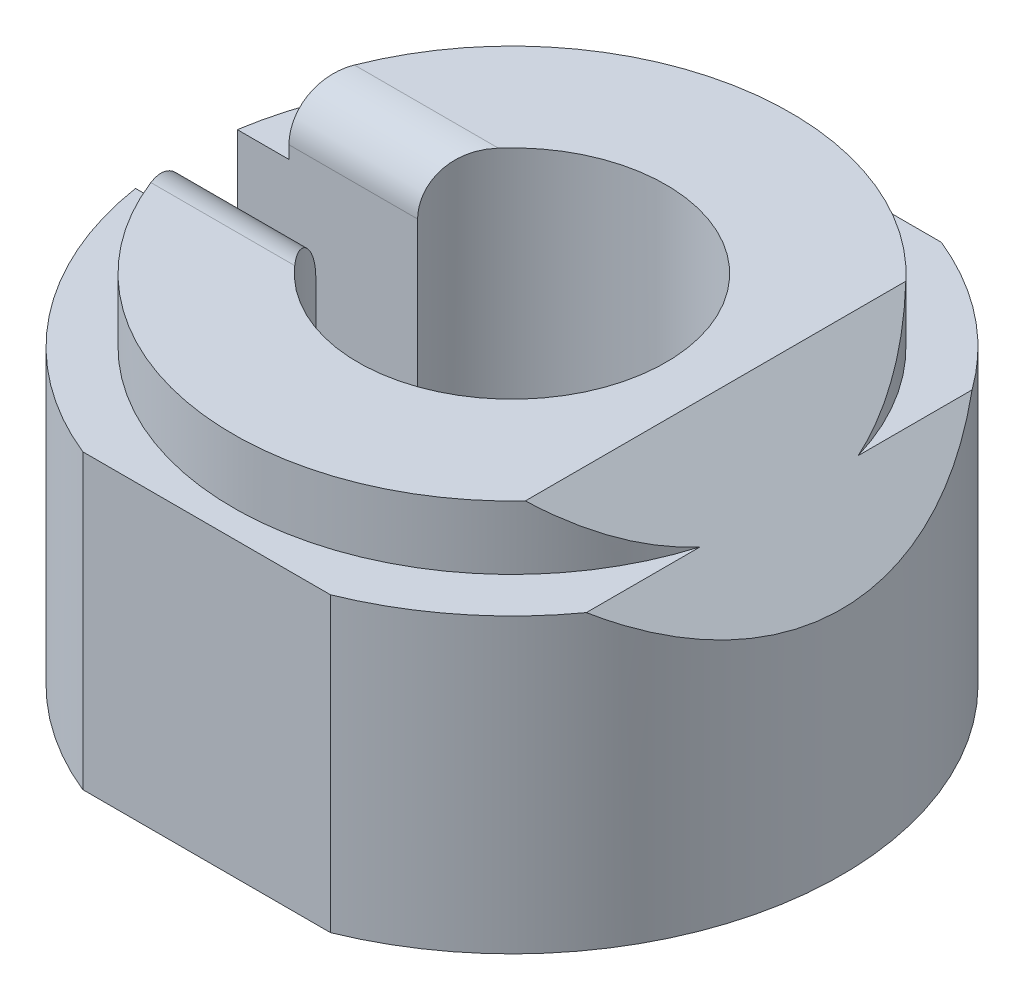
ISO-10303-21;
HEADER;
FILE_DESCRIPTION(('STEP AP214'),'2;1');
FILE_NAME('part.step','',(''),(''),'','','');
FILE_SCHEMA(('AUTOMOTIVE_DESIGN { 1 0 10303 214 1 1 1 1 }'));
ENDSEC;
DATA;
#1=APPLICATION_CONTEXT('core data for automotive mechanical design processes');
#2=APPLICATION_PROTOCOL_DEFINITION('international standard','automotive_design',2000,#1);
#3=PRODUCT_CONTEXT('',#1,'mechanical');
#4=PRODUCT('Part','Part','',(#3));
#5=PRODUCT_RELATED_PRODUCT_CATEGORY('part','',(#4));
#6=PRODUCT_DEFINITION_FORMATION('','',#4);
#7=PRODUCT_DEFINITION_CONTEXT('part definition',#1,'design');
#8=PRODUCT_DEFINITION('design','',#6,#7);
#9=PRODUCT_DEFINITION_SHAPE('','',#8);
#10=(LENGTH_UNIT() NAMED_UNIT(*) SI_UNIT(.MILLI.,.METRE.));
#11=(NAMED_UNIT(*) PLANE_ANGLE_UNIT() SI_UNIT($,.RADIAN.));
#12=(NAMED_UNIT(*) SI_UNIT($,.STERADIAN.) SOLID_ANGLE_UNIT());
#13=UNCERTAINTY_MEASURE_WITH_UNIT(LENGTH_MEASURE(1.E-05),#10,'distance_accuracy_value','');
#14=(GEOMETRIC_REPRESENTATION_CONTEXT(3) GLOBAL_UNCERTAINTY_ASSIGNED_CONTEXT((#13)) GLOBAL_UNIT_ASSIGNED_CONTEXT((#10,
#11,#12)) REPRESENTATION_CONTEXT('',''));
#15=CARTESIAN_POINT('',(0.,0.,0.));
#16=DIRECTION('',(0.,0.,1.));
#17=DIRECTION('',(1.,0.,0.));
#18=AXIS2_PLACEMENT_3D('',#15,#16,#17);
#19=CARTESIAN_POINT('',(0.,9.5,0.));
#20=DIRECTION('',(0.,1.,0.));
#21=DIRECTION('',(0.,0.,1.));
#22=AXIS2_PLACEMENT_3D('',#19,#20,#21);
#23=PLANE('',#22);
#24=CARTESIAN_POINT('',(0.,9.5,0.));
#25=DIRECTION('',(0.,1.,0.));
#26=DIRECTION('',(0.,0.,1.));
#27=AXIS2_PLACEMENT_3D('',#24,#25,#26);
#28=CIRCLE('',#27,12.95);
#29=CARTESIAN_POINT('',(-4.86852133609374,9.5,-12.));
#30=VERTEX_POINT('',#29);
#31=CARTESIAN_POINT('',(-12.7946277788766,9.5,-2.));
#32=VERTEX_POINT('',#31);
#33=EDGE_CURVE('E240',#30,#32,#28,.T.);
#34=ORIENTED_EDGE('',*,*,#33,.T.);
#35=DIRECTION('',(1.,0.,0.));
#36=VECTOR('',#35,1.);
#37=CARTESIAN_POINT('',(0.,9.5,-2.));
#38=LINE('',#37,#36);
#39=CARTESIAN_POINT('',(-10.7658023388877,9.5,-2.));
#40=VERTEX_POINT('',#39);
#41=EDGE_CURVE('E226',#32,#40,#38,.T.);
#42=ORIENTED_EDGE('',*,*,#41,.T.);
#43=CARTESIAN_POINT('',(0.,9.5,0.));
#44=DIRECTION('',(0.,1.,0.));
#45=DIRECTION('',(0.,0.,1.));
#46=AXIS2_PLACEMENT_3D('',#43,#44,#45);
#47=CIRCLE('',#46,10.95);
#48=CARTESIAN_POINT('',(10.5,9.5,-3.10684727658121));
#49=VERTEX_POINT('',#48);
#50=EDGE_CURVE('E236',#40,#49,#47,.F.);
#51=ORIENTED_EDGE('',*,*,#50,.T.);
#52=DIRECTION('',(0.,0.,1.));
#53=VECTOR('',#52,1.);
#54=CARTESIAN_POINT('',(10.5,9.5,0.));
#55=LINE('',#54,#53);
#56=CARTESIAN_POINT('',(10.5,9.5,-7.5797427396977));
#57=VERTEX_POINT('',#56);
#58=EDGE_CURVE('E406',#57,#49,#55,.T.);
#59=ORIENTED_EDGE('',*,*,#58,.F.);
#60=CARTESIAN_POINT('',(4.86852133609374,9.5,-12.));
#61=VERTEX_POINT('',#60);
#62=EDGE_CURVE('E377',#57,#61,#28,.T.);
#63=ORIENTED_EDGE('',*,*,#62,.T.);
#64=DIRECTION('',(1.,0.,0.));
#65=VECTOR('',#64,1.);
#66=CARTESIAN_POINT('',(0.,9.5,-12.));
#67=LINE('',#66,#65);
#68=EDGE_CURVE('E401',#30,#61,#67,.T.);
#69=ORIENTED_EDGE('',*,*,#68,.F.);
#70=EDGE_LOOP('',(#34,#42,#51,#59,#63,#69));
#71=FACE_BOUND('',#70,.T.);
#72=ADVANCED_FACE('F105',(#71),#23,.T.);
#73=CARTESIAN_POINT('',(0.,-2.,0.));
#74=DIRECTION('',(0.,1.,0.));
#75=DIRECTION('',(0.,0.,1.));
#76=AXIS2_PLACEMENT_3D('',#73,#74,#75);
#77=CYLINDRICAL_SURFACE('',#76,10.95);
#78=DIRECTION('',(0.,1.,0.));
#79=VECTOR('',#78,1.);
#80=CARTESIAN_POINT('',(-10.7658023388877,-2.,-2.));
#81=LINE('',#80,#79);
#82=CARTESIAN_POINT('',(-10.7658023388877,10.,-2.));
#83=VERTEX_POINT('',#82);
#84=EDGE_CURVE('E221',#40,#83,#81,.T.);
#85=ORIENTED_EDGE('',*,*,#84,.T.);
#86=CARTESIAN_POINT('',(-10.7658023388877,10.,-2.));
#87=CARTESIAN_POINT('',(-10.7657998873099,10.0553582028588,-1.99999993684639));
#88=CARTESIAN_POINT('',(-10.7653753538818,10.1106898730469,-2.00229990746368));
#89=CARTESIAN_POINT('',(-10.7636662232265,10.2209566549138,-2.01147247984258));
#90=CARTESIAN_POINT('',(-10.7623816690621,10.2758917863087,-2.01834485265639));
#91=CARTESIAN_POINT('',(-10.757220221801,10.4394004844256,-2.04574708555658));
#92=CARTESIAN_POINT('',(-10.7520356433773,10.5468776363525,-2.0730622841861));
#93=CARTESIAN_POINT('',(-10.7379249867092,10.7556341988424,-2.14494578853034));
#94=CARTESIAN_POINT('',(-10.7289971088818,10.8569106015351,-2.18952239183904));
#95=CARTESIAN_POINT('',(-10.7070375952912,11.0504094007113,-2.29449546774585));
#96=CARTESIAN_POINT('',(-10.6940065910536,11.1426331876494,-2.3548895055899));
#97=CARTESIAN_POINT('',(-10.663441302374,11.3156132570701,-2.48963518133261));
#98=CARTESIAN_POINT('',(-10.6459003049603,11.3963521640152,-2.56400758077179));
#99=CARTESIAN_POINT('',(-10.6060347247716,11.5440971934401,-2.72421116398895));
#100=CARTESIAN_POINT('',(-10.583710153558,11.6111033491097,-2.81004232007207));
#101=CARTESIAN_POINT('',(-10.5338703812319,11.7305650593691,-2.99149138482339));
#102=CARTESIAN_POINT('',(-10.5062953235317,11.7828336329972,-3.08721567446595));
#103=CARTESIAN_POINT('',(-10.4462675291435,11.8707994852415,-3.28460588133174));
#104=CARTESIAN_POINT('',(-10.4138128839891,11.9064902576427,-3.38627411375307));
#105=CARTESIAN_POINT('',(-10.3508352796189,11.9559582584554,-3.57359590414467));
#106=CARTESIAN_POINT('',(-10.3210475147448,11.972552033782,-3.65877150228198));
#107=CARTESIAN_POINT('',(-10.2589563222909,11.9945730418643,-3.82944868317047));
#108=CARTESIAN_POINT('',(-10.2266582993269,12.0000236106701,-3.91494920822444));
#109=CARTESIAN_POINT('',(-10.1932575754761,12.,-4.));
#110=B_SPLINE_CURVE_WITH_KNOTS('',3,(#86,#87,#88,#89,#90,#91,#92,#93,#94,#95,#96,#97,#98,#99,
#100,#101,#102,#103,#104,#105,#106,#107,#108,#109),.UNSPECIFIED.,.F.,.F.,(4,2,2,2,2,2,2,2,2,2,2,
4),(0.,0.165972516705542,0.331936723516194,0.663271950051158,0.994766648251569,1.32621034992755,
1.65815027952558,1.99008940686704,2.3260677397977,2.66217782144776,2.93671832017174,
3.21068328609285),.UNSPECIFIED.);
#111=CARTESIAN_POINT('',(-10.1932575754761,12.,-4.));
#112=VERTEX_POINT('',#111);
#113=EDGE_CURVE('E444',#83,#112,#110,.T.);
#114=ORIENTED_EDGE('',*,*,#113,.T.);
#115=CARTESIAN_POINT('',(0.,12.,0.));
#116=DIRECTION('',(0.,1.,0.));
#117=DIRECTION('',(0.,0.,1.));
#118=AXIS2_PLACEMENT_3D('',#115,#116,#117);
#119=CIRCLE('',#118,10.95);
#120=CARTESIAN_POINT('',(8.,12.,-7.47679744275582));
#121=VERTEX_POINT('',#120);
#122=EDGE_CURVE('E251',#121,#112,#119,.T.);
#123=ORIENTED_EDGE('',*,*,#122,.F.);
#124=CARTESIAN_POINT('',(0.,20.,0.));
#125=DIRECTION('',(-0.707106781186547,-0.707106781186547,0.));
#126=DIRECTION('',(-0.707106781186548,0.707106781186548,0.));
#127=AXIS2_PLACEMENT_3D('',#124,#125,#126);
#128=ELLIPSE('',#127,15.4856385079854,10.95);
#129=EDGE_CURVE('E246',#49,#121,#128,.F.);
#130=ORIENTED_EDGE('',*,*,#129,.F.);
#131=ORIENTED_EDGE('',*,*,#50,.F.);
#132=EDGE_LOOP('',(#85,#114,#123,#130,#131));
#133=FACE_BOUND('',#132,.T.);
#134=ADVANCED_FACE('F244',(#133),#77,.T.);
#135=CARTESIAN_POINT('',(0.,-38.6281312654632,0.));
#136=DIRECTION('',(0.,1.,0.));
#137=DIRECTION('',(0.,0.,1.));
#138=AXIS2_PLACEMENT_3D('',#135,#136,#137);
#139=CYLINDRICAL_SURFACE('',#138,12.95);
#140=CARTESIAN_POINT('',(0.,20.,0.));
#141=DIRECTION('',(-0.707106781186547,-0.707106781186547,0.));
#142=DIRECTION('',(-0.707106781186548,0.707106781186548,0.));
#143=AXIS2_PLACEMENT_3D('',#140,#141,#142);
#144=ELLIPSE('',#143,18.3140656327316,12.95);
#145=CARTESIAN_POINT('',(10.5,9.5,7.5797427396977));
#146=VERTEX_POINT('',#145);
#147=EDGE_CURVE('E404',#146,#57,#144,.F.);
#148=ORIENTED_EDGE('',*,*,#147,.F.);
#149=CARTESIAN_POINT('',(4.86852133609374,9.5,12.));
#150=VERTEX_POINT('',#149);
#151=EDGE_CURVE('E378',#150,#146,#28,.T.);
#152=ORIENTED_EDGE('',*,*,#151,.F.);
#153=DIRECTION('',(0.,1.,0.));
#154=VECTOR('',#153,1.);
#155=CARTESIAN_POINT('',(4.86852133609374,-38.6281312654632,12.));
#156=LINE('',#155,#154);
#157=CARTESIAN_POINT('',(4.86852133609374,-2.,12.));
#158=VERTEX_POINT('',#157);
#159=EDGE_CURVE('E375',#150,#158,#156,.F.);
#160=ORIENTED_EDGE('',*,*,#159,.T.);
#161=CARTESIAN_POINT('',(0.,-2.,0.));
#162=DIRECTION('',(0.,1.,0.));
#163=DIRECTION('',(0.,0.,1.));
#164=AXIS2_PLACEMENT_3D('',#161,#162,#163);
#165=CIRCLE('',#164,12.95);
#166=CARTESIAN_POINT('',(4.86852133609374,-2.,-12.));
#167=VERTEX_POINT('',#166);
#168=EDGE_CURVE('E384',#167,#158,#165,.F.);
#169=ORIENTED_EDGE('',*,*,#168,.F.);
#170=DIRECTION('',(0.,1.,0.));
#171=VECTOR('',#170,1.);
#172=CARTESIAN_POINT('',(4.86852133609374,-38.6281312654632,-12.));
#173=LINE('',#172,#171);
#174=EDGE_CURVE('E397',#61,#167,#173,.F.);
#175=ORIENTED_EDGE('',*,*,#174,.F.);
#176=ORIENTED_EDGE('',*,*,#62,.F.);
#177=EDGE_LOOP('',(#148,#152,#160,#169,#175,#176));
#178=FACE_BOUND('',#177,.T.);
#179=ADVANCED_FACE('F308',(#178),#139,.T.);
#180=DIRECTION('',(0.,1.,0.));
#181=VECTOR('',#180,1.);
#182=CARTESIAN_POINT('',(-12.7946277788766,-38.6281312654632,2.));
#183=LINE('',#182,#181);
#184=CARTESIAN_POINT('',(-12.7946277788766,2.,2.));
#185=VERTEX_POINT('',#184);
#186=CARTESIAN_POINT('',(-12.7946277788766,9.5,2.));
#187=VERTEX_POINT('',#186);
#188=EDGE_CURVE('E369',#185,#187,#183,.T.);
#189=ORIENTED_EDGE('',*,*,#188,.F.);
#190=CARTESIAN_POINT('',(-12.7946277788766,2.,2.));
#191=CARTESIAN_POINT('',(-12.7946256332506,1.94408781043635,2.00000002573826));
#192=CARTESIAN_POINT('',(-12.7949947479576,1.88820273819576,1.99765388963397));
#193=CARTESIAN_POINT('',(-12.7964529824156,1.77683916091667,1.98829682131698));
#194=CARTESIAN_POINT('',(-12.7975420354279,1.72136061867447,1.98128632149406));
#195=CARTESIAN_POINT('',(-12.8018492907163,1.55628329415424,1.95333880678219));
#196=CARTESIAN_POINT('',(-12.8061077787187,1.44780072599633,1.92548550077359));
#197=CARTESIAN_POINT('',(-12.8169175381375,1.23712269491746,1.85215577418208));
#198=CARTESIAN_POINT('',(-12.8234694310701,1.13492894511174,1.80667457605526));
#199=CARTESIAN_POINT('',(-12.8381248342533,0.939604815726317,1.69940297039855));
#200=CARTESIAN_POINT('',(-12.8462283567749,0.846474507833138,1.63761243388568));
#201=CARTESIAN_POINT('',(-12.8631491660451,0.67116909493783,1.49893143639688));
#202=CARTESIAN_POINT('',(-12.8719713191882,0.589080746372092,1.42193194358738));
#203=CARTESIAN_POINT('',(-12.8892934354307,0.438922995521076,1.25523787570596));
#204=CARTESIAN_POINT('',(-12.8977933369221,0.37085626297225,1.16554088848749));
#205=CARTESIAN_POINT('',(-12.9135655225394,0.250350104548857,0.975429449628954));
#206=CARTESIAN_POINT('',(-12.9208310146627,0.197995996840185,0.874960367828575));
#207=CARTESIAN_POINT('',(-12.9332549284202,0.110966222855452,0.666545430716961));
#208=CARTESIAN_POINT('',(-12.9384147257827,0.0762790104560916,0.558604511132324));
#209=CARTESIAN_POINT('',(-12.9447779408629,0.0340254317766947,0.375025780588701));
#210=CARTESIAN_POINT('',(-12.9467261965863,0.0212778955814986,0.300564992169304));
#211=CARTESIAN_POINT('',(-12.9493413997215,0.00426401957549387,0.150747445660465));
#212=CARTESIAN_POINT('',(-12.9500098440486,-1.22287739625539E-05,0.0753918381634177));
#213=CARTESIAN_POINT('',(-12.95,0.,0.));
#214=B_SPLINE_CURVE_WITH_KNOTS('',3,(#190,#191,#192,#193,#194,#195,#196,#197,#198,#199,#200,
#201,#202,#203,#204,#205,#206,#207,#208,#209,#210,#211,#212,#213),.UNSPECIFIED.,.F.,.F.,(4,2,2,
2,2,2,2,2,2,2,2,4),(0.,0.167632475682958,0.335249413883563,0.669766357677263,1.00437402633827,
1.33898434133517,1.67608672267633,2.01325322960552,2.35221870858211,2.69096237295107,
2.91720895132186,3.14319074117967),.UNSPECIFIED.);
#215=CARTESIAN_POINT('',(-12.95,0.,0.));
#216=VERTEX_POINT('',#215);
#217=EDGE_CURVE('E115',#185,#216,#214,.T.);
#218=ORIENTED_EDGE('',*,*,#217,.T.);
#219=CARTESIAN_POINT('',(-12.95,0.,0.));
#220=CARTESIAN_POINT('',(-12.950002014148,-1.48172827576487E-08,-0.0559162229000142));
#221=CARTESIAN_POINT('',(-12.9496373883563,0.00234644960810226,-0.111805341523206));
#222=CARTESIAN_POINT('',(-12.9481962405879,0.0117048966110774,-0.223177238487953));
#223=CARTESIAN_POINT('',(-12.9471197832777,0.0187164553872645,-0.278660053277413));
#224=CARTESIAN_POINT('',(-12.942860681548,0.0466685575209166,-0.443751704701726));
#225=CARTESIAN_POINT('',(-12.9386481279771,0.074526800289537,-0.55224462048176));
#226=CARTESIAN_POINT('',(-12.9279380237389,0.147870899920632,-0.762943912039565));
#227=CARTESIAN_POINT('',(-12.9214398346178,0.193361682499116,-0.865148521902833));
#228=CARTESIAN_POINT('',(-12.9068762993701,0.300655680759331,-1.06049052813423));
#229=CARTESIAN_POINT('',(-12.8988109492736,0.362458937763857,-1.15362790153239));
#230=CARTESIAN_POINT('',(-12.8819363508063,0.501152788024086,-1.32892507689081));
#231=CARTESIAN_POINT('',(-12.8731221313219,0.578149556362757,-1.41100036080273));
#232=CARTESIAN_POINT('',(-12.8557803600952,0.744832811767629,-1.56113298045433));
#233=CARTESIAN_POINT('',(-12.8472528645212,0.834521767473071,-1.62918758282288));
#234=CARTESIAN_POINT('',(-12.8314006752412,1.02462611917453,-1.7496809627547));
#235=CARTESIAN_POINT('',(-12.824082821451,1.12509754611792,-1.80203221684575));
#236=CARTESIAN_POINT('',(-12.8115538637689,1.33351726637838,-1.88905593253119));
#237=CARTESIAN_POINT('',(-12.8063413737306,1.44146058526554,-1.92374002991201));
#238=CARTESIAN_POINT('',(-12.7999100470753,1.62503072282316,-1.96598485794204));
#239=CARTESIAN_POINT('',(-12.7979397392583,1.69947979903887,-1.97872844716275));
#240=CARTESIAN_POINT('',(-12.7952941861159,1.84927457081914,-1.99573722333451));
#241=CARTESIAN_POINT('',(-12.7946174381016,1.92461912358411,-2.0000122481689));
#242=CARTESIAN_POINT('',(-12.7946277788766,2.,-2.));
#243=B_SPLINE_CURVE_WITH_KNOTS('',3,(#219,#220,#221,#222,#223,#224,#225,#226,#227,#228,#229,
#230,#231,#232,#233,#234,#235,#236,#237,#238,#239,#240,#241,#242),.UNSPECIFIED.,.F.,.F.,(4,2,2,
2,2,2,2,2,2,2,2,4),(0.,0.167644611880985,0.335273996133688,0.669819430009937,1.00445838783946,
1.33909819338527,1.67616509087818,2.01329763845469,2.35227571580648,2.69103024881158,
2.91724192675227,3.14319066139638),.UNSPECIFIED.);
#244=CARTESIAN_POINT('',(-12.7946277788766,2.,-2.));
#245=VERTEX_POINT('',#244);
#246=EDGE_CURVE('E322',#216,#245,#243,.T.);
#247=ORIENTED_EDGE('',*,*,#246,.T.);
#248=DIRECTION('',(0.,1.,0.));
#249=VECTOR('',#248,1.);
#250=CARTESIAN_POINT('',(-12.7946277788766,-38.6281312654632,-2.));
#251=LINE('',#250,#249);
#252=EDGE_CURVE('E241',#245,#32,#251,.T.);
#253=ORIENTED_EDGE('',*,*,#252,.T.);
#254=ORIENTED_EDGE('',*,*,#33,.F.);
#255=DIRECTION('',(0.,1.,0.));
#256=VECTOR('',#255,1.);
#257=CARTESIAN_POINT('',(-4.86852133609374,-38.6281312654632,-12.));
#258=LINE('',#257,#256);
#259=CARTESIAN_POINT('',(-4.86852133609374,-2.,-12.));
#260=VERTEX_POINT('',#259);
#261=EDGE_CURVE('E399',#260,#30,#258,.T.);
#262=ORIENTED_EDGE('',*,*,#261,.F.);
#263=CARTESIAN_POINT('',(-4.86852133609374,-2.,12.));
#264=VERTEX_POINT('',#263);
#265=EDGE_CURVE('E387',#264,#260,#165,.F.);
#266=ORIENTED_EDGE('',*,*,#265,.F.);
#267=DIRECTION('',(0.,1.,0.));
#268=VECTOR('',#267,1.);
#269=CARTESIAN_POINT('',(-4.86852133609374,-38.6281312654632,12.));
#270=LINE('',#269,#268);
#271=CARTESIAN_POINT('',(-4.86852133609374,9.5,12.));
#272=VERTEX_POINT('',#271);
#273=EDGE_CURVE('E374',#264,#272,#270,.T.);
#274=ORIENTED_EDGE('',*,*,#273,.T.);
#275=EDGE_CURVE('E362',#187,#272,#28,.T.);
#276=ORIENTED_EDGE('',*,*,#275,.F.);
#277=EDGE_LOOP('',(#189,#218,#247,#253,#254,#262,#266,#274,#276));
#278=FACE_BOUND('',#277,.T.);
#279=ADVANCED_FACE('F351',(#278),#139,.T.);
#280=DIRECTION('',(1.,0.,0.));
#281=VECTOR('',#280,1.);
#282=CARTESIAN_POINT('',(0.,9.5,2.));
#283=LINE('',#282,#281);
#284=CARTESIAN_POINT('',(-10.7658023388877,9.5,2.));
#285=VERTEX_POINT('',#284);
#286=EDGE_CURVE('E359',#187,#285,#283,.T.);
#287=ORIENTED_EDGE('',*,*,#286,.F.);
#288=ORIENTED_EDGE('',*,*,#275,.T.);
#289=DIRECTION('',(1.,0.,0.));
#290=VECTOR('',#289,1.);
#291=CARTESIAN_POINT('',(0.,9.5,12.));
#292=LINE('',#291,#290);
#293=EDGE_CURVE('E395',#272,#150,#292,.T.);
#294=ORIENTED_EDGE('',*,*,#293,.T.);
#295=ORIENTED_EDGE('',*,*,#151,.T.);
#296=CARTESIAN_POINT('',(10.5,9.5,3.10684727658121));
#297=VERTEX_POINT('',#296);
#298=EDGE_CURVE('E407',#297,#146,#55,.T.);
#299=ORIENTED_EDGE('',*,*,#298,.F.);
#300=EDGE_CURVE('E247',#297,#285,#47,.F.);
#301=ORIENTED_EDGE('',*,*,#300,.T.);
#302=EDGE_LOOP('',(#287,#288,#294,#295,#299,#301));
#303=FACE_BOUND('',#302,.T.);
#304=ADVANCED_FACE('F344',(#303),#23,.T.);
#305=CARTESIAN_POINT('',(0.,-2.,0.));
#306=DIRECTION('',(0.,1.,0.));
#307=DIRECTION('',(0.,0.,1.));
#308=AXIS2_PLACEMENT_3D('',#305,#306,#307);
#309=PLANE('',#308);
#310=CARTESIAN_POINT('',(0.,-2.,0.));
#311=DIRECTION('',(0.,1.,0.));
#312=DIRECTION('',(0.,0.,1.));
#313=AXIS2_PLACEMENT_3D('',#310,#311,#312);
#314=CIRCLE('',#313,1.6);
#315=CARTESIAN_POINT('',(0.,-2.,1.6));
#316=VERTEX_POINT('',#315);
#317=EDGE_CURVE('E420',#316,#316,#314,.T.);
#318=ORIENTED_EDGE('',*,*,#317,.T.);
#319=EDGE_LOOP('',(#318));
#320=FACE_BOUND('',#319,.T.);
#321=DIRECTION('',(1.,0.,0.));
#322=VECTOR('',#321,1.);
#323=CARTESIAN_POINT('',(0.,-2.,12.));
#324=LINE('',#323,#322);
#325=EDGE_CURVE('E257',#264,#158,#324,.T.);
#326=ORIENTED_EDGE('',*,*,#325,.F.);
#327=ORIENTED_EDGE('',*,*,#265,.T.);
#328=DIRECTION('',(1.,0.,0.));
#329=VECTOR('',#328,1.);
#330=CARTESIAN_POINT('',(0.,-2.,-12.));
#331=LINE('',#330,#329);
#332=EDGE_CURVE('E250',#260,#167,#331,.T.);
#333=ORIENTED_EDGE('',*,*,#332,.T.);
#334=ORIENTED_EDGE('',*,*,#168,.T.);
#335=EDGE_LOOP('',(#326,#327,#333,#334));
#336=FACE_BOUND('',#335,.T.);
#337=ADVANCED_FACE('F350',(#320,#336),#309,.F.);
#338=CARTESIAN_POINT('',(-10.1932575754761,12.,4.));
#339=VERTEX_POINT('',#338);
#340=CARTESIAN_POINT('',(8.,12.,7.47679744275582));
#341=VERTEX_POINT('',#340);
#342=EDGE_CURVE('E611',#339,#341,#119,.T.);
#343=ORIENTED_EDGE('',*,*,#342,.F.);
#344=CARTESIAN_POINT('',(-10.1932575754761,12.,4.));
#345=CARTESIAN_POINT('',(-10.215252763081,11.9999980404342,3.94395580736491));
#346=CARTESIAN_POINT('',(-10.2367726894939,11.9976424240735,3.88774865686013));
#347=CARTESIAN_POINT('',(-10.278763936511,11.9881427232847,3.77532885443158));
#348=CARTESIAN_POINT('',(-10.2992349308407,11.9809971585409,3.7191162061801));
#349=CARTESIAN_POINT('',(-10.3589318186561,11.9522440665045,3.55093412099844));
#350=CARTESIAN_POINT('',(-10.396414218504,11.9233199415595,3.43949052860539));
#351=CARTESIAN_POINT('',(-10.4660062849451,11.8459210445999,3.22154624898223));
#352=CARTESIAN_POINT('',(-10.4981034747342,11.7974017349488,3.11505744249417));
#353=CARTESIAN_POINT('',(-10.5564731190204,11.6816816580941,2.91111916175955));
#354=CARTESIAN_POINT('',(-10.5827523464388,11.6145028208865,2.81365925433323));
#355=CARTESIAN_POINT('',(-10.6284541461997,11.4667138672042,2.6356283805551));
#356=CARTESIAN_POINT('',(-10.648139927659,11.386878914054,2.55448069235084));
#357=CARTESIAN_POINT('',(-10.6825646937403,11.2139256856405,2.40647086598696));
#358=CARTESIAN_POINT('',(-10.6973022679429,11.1208036338297,2.33961280286125));
#359=CARTESIAN_POINT('',(-10.721848488476,10.9270807844682,2.22437484910673));
#360=CARTESIAN_POINT('',(-10.7317936886813,10.8267944908461,2.17549381476017));
#361=CARTESIAN_POINT('',(-10.7477910021851,10.6192576023916,2.09503794195539));
#362=CARTESIAN_POINT('',(-10.7538463120501,10.5120128058043,2.06344889675159));
#363=CARTESIAN_POINT('',(-10.7606900674744,10.3366406188279,2.02737163758506));
#364=CARTESIAN_POINT('',(-10.7626129789312,10.269688414526,2.01711247846942));
#365=CARTESIAN_POINT('',(-10.7651655394167,10.1351674568692,2.00342879892052));
#366=CARTESIAN_POINT('',(-10.7657971441038,10.0675997917526,1.99999394343758));
#367=CARTESIAN_POINT('',(-10.7658023388877,10.,2.));
#368=B_SPLINE_CURVE_WITH_KNOTS('',3,(#344,#345,#346,#347,#348,#349,#350,#351,#352,#353,#354,
#355,#356,#357,#358,#359,#360,#361,#362,#363,#364,#365,#366,#367),.UNSPECIFIED.,.F.,.F.,(4,2,2,
2,2,2,2,2,2,2,2,4),(0.,0.180521425972547,0.36109866715912,0.722475887843784,1.08467914258227,
1.44645849863325,1.79131682507501,2.1362733654185,2.47071461982338,2.80488069013857,
3.00783442325068,3.21048055858087),.UNSPECIFIED.);
#369=CARTESIAN_POINT('',(-10.7658023388877,10.,2.));
#370=VERTEX_POINT('',#369);
#371=EDGE_CURVE('E267',#339,#370,#368,.T.);
#372=ORIENTED_EDGE('',*,*,#371,.T.);
#373=DIRECTION('',(0.,1.,0.));
#374=VECTOR('',#373,1.);
#375=CARTESIAN_POINT('',(-10.7658023388877,-2.,2.));
#376=LINE('',#375,#374);
#377=EDGE_CURVE('E370',#285,#370,#376,.T.);
#378=ORIENTED_EDGE('',*,*,#377,.F.);
#379=ORIENTED_EDGE('',*,*,#300,.F.);
#380=EDGE_CURVE('E409',#341,#297,#128,.F.);
#381=ORIENTED_EDGE('',*,*,#380,.F.);
#382=EDGE_LOOP('',(#343,#372,#378,#379,#381));
#383=FACE_BOUND('',#382,.T.);
#384=ADVANCED_FACE('F276',(#383),#77,.T.);
#385=CARTESIAN_POINT('',(0.,12.,0.));
#386=DIRECTION('',(0.,1.,0.));
#387=DIRECTION('',(0.,0.,1.));
#388=AXIS2_PLACEMENT_3D('',#385,#386,#387);
#389=PLANE('',#388);
#390=CARTESIAN_POINT('',(0.,12.,0.));
#391=DIRECTION('',(0.,1.,0.));
#392=DIRECTION('',(0.,0.,1.));
#393=AXIS2_PLACEMENT_3D('',#390,#391,#392);
#394=CIRCLE('',#393,6.05);
#395=CARTESIAN_POINT('',(-4.53899768671454,12.,4.));
#396=VERTEX_POINT('',#395);
#397=CARTESIAN_POINT('',(-4.53899768671455,12.,-4.));
#398=VERTEX_POINT('',#397);
#399=EDGE_CURVE('E392',#396,#398,#394,.T.);
#400=ORIENTED_EDGE('',*,*,#399,.F.);
#401=DIRECTION('',(-1.,0.,0.));
#402=VECTOR('',#401,1.);
#403=CARTESIAN_POINT('',(-10.7658023388877,12.,4.));
#404=LINE('',#403,#402);
#405=EDGE_CURVE('E264',#396,#339,#404,.T.);
#406=ORIENTED_EDGE('',*,*,#405,.T.);
#407=ORIENTED_EDGE('',*,*,#342,.T.);
#408=DIRECTION('',(0.,0.,1.));
#409=VECTOR('',#408,1.);
#410=CARTESIAN_POINT('',(8.,12.,0.));
#411=LINE('',#410,#409);
#412=EDGE_CURVE('E259',#121,#341,#411,.T.);
#413=ORIENTED_EDGE('',*,*,#412,.F.);
#414=ORIENTED_EDGE('',*,*,#122,.T.);
#415=DIRECTION('',(-1.,0.,0.));
#416=VECTOR('',#415,1.);
#417=CARTESIAN_POINT('',(0.,12.,-4.));
#418=LINE('',#417,#416);
#419=EDGE_CURVE('E262',#112,#398,#418,.F.);
#420=ORIENTED_EDGE('',*,*,#419,.T.);
#421=EDGE_LOOP('',(#400,#406,#407,#413,#414,#420));
#422=FACE_BOUND('',#421,.T.);
#423=ADVANCED_FACE('F307',(#422),#389,.T.);
#424=CARTESIAN_POINT('',(0.,12.,0.));
#425=DIRECTION('',(0.,-1.,0.));
#426=DIRECTION('',(0.,0.,-1.));
#427=AXIS2_PLACEMENT_3D('',#424,#425,#426);
#428=CYLINDRICAL_SURFACE('',#427,6.05);
#429=DIRECTION('',(0.,-1.,0.));
#430=VECTOR('',#429,1.);
#431=CARTESIAN_POINT('',(-5.70985989320228,12.,2.));
#432=LINE('',#431,#430);
#433=CARTESIAN_POINT('',(-5.70985989320228,10.,2.));
#434=VERTEX_POINT('',#433);
#435=CARTESIAN_POINT('',(-5.70985989320228,2.,2.));
#436=VERTEX_POINT('',#435);
#437=EDGE_CURVE('E413',#434,#436,#432,.T.);
#438=ORIENTED_EDGE('',*,*,#437,.F.);
#439=CARTESIAN_POINT('',(-5.70985989320228,10.,2.));
#440=CARTESIAN_POINT('',(-5.70985665184003,10.0532053042563,1.99999336319484));
#441=CARTESIAN_POINT('',(-5.70911610995553,10.106408198698,2.00212303069396));
#442=CARTESIAN_POINT('',(-5.70613760373049,10.2124313776622,2.01060455256753));
#443=CARTESIAN_POINT('',(-5.7038997204515,10.2652516827405,2.01695617837775));
#444=CARTESIAN_POINT('',(-5.69790683103353,10.3700832199718,2.03382243456253));
#445=CARTESIAN_POINT('',(-5.69415340435184,10.422095236076,2.04433273065822));
#446=CARTESIAN_POINT('',(-5.68508985943883,10.5249797618576,2.0694031316168));
#447=CARTESIAN_POINT('',(-5.6797797620688,10.5758522867959,2.0839631822079));
#448=CARTESIAN_POINT('',(-5.66142560404254,10.7262712050896,2.13354689532509));
#449=CARTESIAN_POINT('',(-5.64595546194936,10.8236597079092,2.17448076487204));
#450=CARTESIAN_POINT('',(-5.60806890333301,11.0096716006424,2.27039669087423));
#451=CARTESIAN_POINT('',(-5.58565434606532,11.09829732828,2.32537498646975));
#452=CARTESIAN_POINT('',(-5.53329263570168,11.2649151662318,2.44736196058285));
#453=CARTESIAN_POINT('',(-5.50331588685253,11.3428635954746,2.51441760355374));
#454=CARTESIAN_POINT('',(-5.43561959081167,11.4860008954284,2.65759270433749));
#455=CARTESIAN_POINT('',(-5.39789887109547,11.551187830982,2.73371353398806));
#456=CARTESIAN_POINT('',(-5.31333235029421,11.6699608052301,2.8947440315096));
#457=CARTESIAN_POINT('',(-5.26621221211059,11.7230580441056,2.97986868169871));
#458=CARTESIAN_POINT('',(-5.16423745906089,11.814586533647,3.15329686891499));
#459=CARTESIAN_POINT('',(-5.10937859729739,11.8530096881788,3.24160213146669));
#460=CARTESIAN_POINT('',(-4.98660868172301,11.9192117565667,3.42781787679961));
#461=CARTESIAN_POINT('',(-4.91793216678617,11.9454518422045,3.52576450288015));
#462=CARTESIAN_POINT('',(-4.77342353859703,11.9826169982765,3.71906983601741));
#463=CARTESIAN_POINT('',(-4.69759553673488,11.9935508116895,3.81442998992018));
#464=CARTESIAN_POINT('',(-4.5925521730883,11.9993001488052,3.93861037214574));
#465=CARTESIAN_POINT('',(-4.56592474728217,12.0000006374235,3.96945085853243));
#466=CARTESIAN_POINT('',(-4.53899768671454,12.,4.));
#467=B_SPLINE_CURVE_WITH_KNOTS('',3,(#439,#440,#441,#442,#443,#444,#445,#446,#447,#448,#449,
#450,#451,#452,#453,#454,#455,#456,#457,#458,#459,#460,#461,#462,#463,#464,#465,#466),
.UNSPECIFIED.,.F.,.F.,(4,2,2,2,2,2,2,2,2,2,2,2,2,4),(0.,0.159563818875073,0.319119000144218,
0.478508324860532,0.637895513663203,0.956547369648708,1.27511398534209,1.59494724331591,
1.91482896341394,2.24596417783348,2.57728182648455,2.94334475203772,3.30919849615182,
3.43140717377676),.UNSPECIFIED.);
#468=EDGE_CURVE('E288',#434,#396,#467,.T.);
#469=ORIENTED_EDGE('',*,*,#468,.T.);
#470=ORIENTED_EDGE('',*,*,#399,.T.);
#471=CARTESIAN_POINT('',(-4.53899768671455,12.,-4.));
#472=CARTESIAN_POINT('',(-4.5952123473944,12.0000018733828,-3.93624044359645));
#473=CARTESIAN_POINT('',(-4.65009154089937,11.9969487981662,-3.87122741054082));
#474=CARTESIAN_POINT('',(-4.7568872906507,11.9840360777183,-3.73920943612675));
#475=CARTESIAN_POINT('',(-4.80879614295638,11.9741595309356,-3.67219994485277));
#476=CARTESIAN_POINT('',(-4.90928607823458,11.9468391869046,-3.53674437058339));
#477=CARTESIAN_POINT('',(-4.95785229014921,11.9293638236765,-3.46829344088454));
#478=CARTESIAN_POINT('',(-5.0509125213973,11.8862687103958,-3.33131147001513));
#479=CARTESIAN_POINT('',(-5.09541132393386,11.860658689466,-3.26278062148351));
#480=CARTESIAN_POINT('',(-5.19553953126565,11.7898137980772,-3.10174360738454));
#481=CARTESIAN_POINT('',(-5.249270406032,11.7408263874968,-3.00965658146611));
#482=CARTESIAN_POINT('',(-5.34755544814235,11.6264751161215,-2.83134348442092));
#483=CARTESIAN_POINT('',(-5.39213764589307,11.5611626797759,-2.74510007009821));
#484=CARTESIAN_POINT('',(-5.47224269093292,11.4144420933058,-2.58174141576826));
#485=CARTESIAN_POINT('',(-5.50772072186009,11.3329576925376,-2.50467229742834));
#486=CARTESIAN_POINT('',(-5.56956834027568,11.155936044029,-2.36396889811566));
#487=CARTESIAN_POINT('',(-5.5959298187724,11.0603863926576,-2.30034659727504));
#488=CARTESIAN_POINT('',(-5.63852934951998,10.8654210698728,-2.19375428895123));
#489=CARTESIAN_POINT('',(-5.65534971652824,10.7667518748655,-2.14964517666545));
#490=CARTESIAN_POINT('',(-5.68214482546019,10.5628206186785,-2.07779109971032));
#491=CARTESIAN_POINT('',(-5.69212783275956,10.4575666861513,-2.05002638276635));
#492=CARTESIAN_POINT('',(-5.70258423732893,10.2928345098792,-2.02067873055963));
#493=CARTESIAN_POINT('',(-5.70531934116723,10.2345239971802,-2.01292780457876));
#494=CARTESIAN_POINT('',(-5.70895278043218,10.117484991288,-2.00259108956099));
#495=CARTESIAN_POINT('',(-5.70985406972261,10.0587573234349,-1.99999699418221));
#496=CARTESIAN_POINT('',(-5.70985989320229,10.,-2.));
#497=B_SPLINE_CURVE_WITH_KNOTS('',3,(#471,#472,#473,#474,#475,#476,#477,#478,#479,#480,#481,
#482,#483,#484,#485,#486,#487,#488,#489,#490,#491,#492,#493,#494,#495,#496),.UNSPECIFIED.,.F.,
.F.,(4,2,2,2,2,2,2,2,2,2,2,2,4),(0.,0.255017477756659,0.510668902185791,0.767392619414928,
1.02381044165644,1.37421394532746,1.72352727654632,2.07452851427363,2.42584116240656,
2.75240620600591,3.0785757797632,3.25500934957452,3.43115849878291),.UNSPECIFIED.);
#498=CARTESIAN_POINT('',(-5.70985989320228,10.,-2.));
#499=VERTEX_POINT('',#498);
#500=EDGE_CURVE('E296',#398,#499,#497,.T.);
#501=ORIENTED_EDGE('',*,*,#500,.T.);
#502=DIRECTION('',(0.,-1.,0.));
#503=VECTOR('',#502,1.);
#504=CARTESIAN_POINT('',(-5.70985989320228,12.,-2.));
#505=LINE('',#504,#503);
#506=CARTESIAN_POINT('',(-5.70985989320228,2.,-2.));
#507=VERTEX_POINT('',#506);
#508=EDGE_CURVE('E232',#499,#507,#505,.T.);
#509=ORIENTED_EDGE('',*,*,#508,.T.);
#510=CARTESIAN_POINT('',(-5.70985989320228,2.,-2.));
#511=CARTESIAN_POINT('',(-5.70985454619172,1.94538882398547,-2.00000146414558));
#512=CARTESIAN_POINT('',(-5.71064436692332,1.89080549208956,-1.99776177596466));
#513=CARTESIAN_POINT('',(-5.71376003215523,1.78206171661891,-1.98883879799724));
#514=CARTESIAN_POINT('',(-5.71608546791247,1.7279011643911,-1.98215669067054));
#515=CARTESIAN_POINT('',(-5.72526072590475,1.5669761485507,-1.9555716296887));
#516=CARTESIAN_POINT('',(-5.73431033753869,1.46134092840127,-1.92912922811394));
#517=CARTESIAN_POINT('',(-5.75718025821854,1.2563345920496,-1.85975502831124));
#518=CARTESIAN_POINT('',(-5.77099810503671,1.15696027409289,-1.81683173921986));
#519=CARTESIAN_POINT('',(-5.80183747665793,0.966733937254765,-1.71579852575221));
#520=CARTESIAN_POINT('',(-5.81886103889058,0.875887393627081,-1.65767893401307));
#521=CARTESIAN_POINT('',(-5.85491970314505,0.701889211680905,-1.5255345150295));
#522=CARTESIAN_POINT('',(-5.87400409315763,0.619113728910057,-1.45102796520311));
#523=CARTESIAN_POINT('',(-5.91161886496638,0.466969922673633,-1.28924419546035));
#524=CARTESIAN_POINT('',(-5.93014913445771,0.397604301654392,-1.20196440760827));
#525=CARTESIAN_POINT('',(-5.96514515833006,0.272526452484959,-1.01433409797155));
#526=CARTESIAN_POINT('',(-5.98154490015012,0.217215013169285,-0.913703277803817));
#527=CARTESIAN_POINT('',(-6.00983328463694,0.124486098506404,-0.70396457625533));
#528=CARTESIAN_POINT('',(-6.02172614669009,0.0870518777383633,-0.594864739548442));
#529=CARTESIAN_POINT('',(-6.03698674789258,0.0396276040281536,-0.404400409825986));
#530=CARTESIAN_POINT('',(-6.04183349541368,0.0248025242287527,-0.324326048570236));
#531=CARTESIAN_POINT('',(-6.04835499781322,0.00497609614951803,-0.162851736240203));
#532=CARTESIAN_POINT('',(-6.05002997545613,-2.59420377199777E-05,-0.0814518786651879));
#533=CARTESIAN_POINT('',(-6.05,0.,0.));
#534=B_SPLINE_CURVE_WITH_KNOTS('',3,(#510,#511,#512,#513,#514,#515,#516,#517,#518,#519,#520,
#521,#522,#523,#524,#525,#526,#527,#528,#529,#530,#531,#532,#533),.UNSPECIFIED.,.F.,.F.,(4,2,2,
2,2,2,2,2,2,2,2,4),(0.,0.163727559945078,0.327411557186456,0.653514454138314,0.979449208999102,
1.3055918189319,1.64304586725044,1.98056785086782,2.32684407546533,2.67279530711605,
2.91690242261774,3.16099239298894),.UNSPECIFIED.);
#535=CARTESIAN_POINT('',(-6.05,0.,0.));
#536=VERTEX_POINT('',#535);
#537=EDGE_CURVE('E316',#507,#536,#534,.T.);
#538=ORIENTED_EDGE('',*,*,#537,.T.);
#539=CARTESIAN_POINT('',(0.,0.,0.));
#540=DIRECTION('',(0.,1.,0.));
#541=DIRECTION('',(0.,0.,1.));
#542=AXIS2_PLACEMENT_3D('',#539,#540,#541);
#543=CIRCLE('',#542,6.05);
#544=EDGE_CURVE('E129',#536,#536,#543,.F.);
#545=ORIENTED_EDGE('',*,*,#544,.T.);
#546=CARTESIAN_POINT('',(-6.05,0.,0.));
#547=CARTESIAN_POINT('',(-6.05000401362191,-1.24449913975849E-06,0.0546938347152173));
#548=CARTESIAN_POINT('',(-6.04925744458581,0.00224502000398289,0.109360113684508));
#549=CARTESIAN_POINT('',(-6.04630601944827,0.0111956227868105,0.21827457745089));
#550=CARTESIAN_POINT('',(-6.04410149433636,0.0178989492129059,0.272522854316861));
#551=CARTESIAN_POINT('',(-6.03538591031431,0.0445759044824946,0.433742373092099));
#552=CARTESIAN_POINT('',(-6.02677221423435,0.0711171461316074,0.539590679517122));
#553=CARTESIAN_POINT('',(-6.00484171630121,0.140778607395596,0.745036193964678));
#554=CARTESIAN_POINT('',(-5.99152653557106,0.183893112822682,0.84463554277215));
#555=CARTESIAN_POINT('',(-5.96155147846482,0.285374101371818,1.03523838803832));
#556=CARTESIAN_POINT('',(-5.94488985300515,0.343748565235628,1.12623735261176));
#557=CARTESIAN_POINT('',(-5.90934839027493,0.476162196962113,1.30008567739267));
#558=CARTESIAN_POINT('',(-5.89041633746775,0.550625435484091,1.38260114330843));
#559=CARTESIAN_POINT('',(-5.85275414296273,0.712213098714132,1.53423740401744));
#560=CARTESIAN_POINT('',(-5.83402406331223,0.799341301475998,1.60335418747533));
#561=CARTESIAN_POINT('',(-5.79830663780007,0.986810588880855,1.72814495516785));
#562=CARTESIAN_POINT('',(-5.78138428489078,1.08745779782668,1.78337898974637));
#563=CARTESIAN_POINT('',(-5.75201329105507,1.29722188523358,1.87595705990209));
#564=CARTESIAN_POINT('',(-5.73955996783666,1.40632975263169,1.91331983330502));
#565=CARTESIAN_POINT('',(-5.72355681502647,1.59660449651895,1.96056961049888));
#566=CARTESIAN_POINT('',(-5.71846197443212,1.67646577777771,1.9753182711289));
#567=CARTESIAN_POINT('',(-5.71159477420978,1.8375328819313,1.99504729182154));
#568=CARTESIAN_POINT('',(-5.70982281407068,1.91873886530735,2.00002647736532));
#569=CARTESIAN_POINT('',(-5.70985989320228,2.,2.));
#570=B_SPLINE_CURVE_WITH_KNOTS('',3,(#546,#547,#548,#549,#550,#551,#552,#553,#554,#555,#556,
#557,#558,#559,#560,#561,#562,#563,#564,#565,#566,#567,#568,#569),.UNSPECIFIED.,.F.,.F.,(4,2,2,
2,2,2,2,2,2,2,2,4),(0.,0.163976335380449,0.327915457138059,0.654602550397157,0.981177108220386,
1.30792280278726,1.64465044288269,1.98147873828635,2.3279200040263,2.67399722922339,
2.9174796854237,3.16099141210289),.UNSPECIFIED.);
#571=EDGE_CURVE('E12',#536,#436,#570,.T.);
#572=ORIENTED_EDGE('',*,*,#571,.T.);
#573=EDGE_LOOP('',(#438,#469,#470,#501,#509,#538,#545,#572));
#574=FACE_BOUND('',#573,.T.);
#575=ADVANCED_FACE('F301',(#574),#428,.F.);
#576=CARTESIAN_POINT('',(0.,0.,0.));
#577=DIRECTION('',(0.,1.,0.));
#578=DIRECTION('',(0.,0.,1.));
#579=AXIS2_PLACEMENT_3D('',#576,#577,#578);
#580=PLANE('',#579);
#581=CARTESIAN_POINT('',(0.,0.,0.));
#582=DIRECTION('',(0.,1.,0.));
#583=DIRECTION('',(0.,0.,1.));
#584=AXIS2_PLACEMENT_3D('',#581,#582,#583);
#585=CIRCLE('',#584,1.6);
#586=CARTESIAN_POINT('',(0.,0.,1.6));
#587=VERTEX_POINT('',#586);
#588=EDGE_CURVE('E110',#587,#587,#585,.T.);
#589=ORIENTED_EDGE('',*,*,#588,.F.);
#590=EDGE_LOOP('',(#589));
#591=FACE_BOUND('',#590,.T.);
#592=ORIENTED_EDGE('',*,*,#544,.F.);
#593=EDGE_LOOP('',(#592));
#594=FACE_BOUND('',#593,.T.);
#595=ADVANCED_FACE('F306',(#591,#594),#580,.T.);
#596=CARTESIAN_POINT('',(0.,-2.,-12.));
#597=DIRECTION('',(0.,0.,1.));
#598=DIRECTION('',(1.,0.,0.));
#599=AXIS2_PLACEMENT_3D('',#596,#597,#598);
#600=PLANE('',#599);
#601=ORIENTED_EDGE('',*,*,#174,.T.);
#602=ORIENTED_EDGE('',*,*,#332,.F.);
#603=ORIENTED_EDGE('',*,*,#261,.T.);
#604=ORIENTED_EDGE('',*,*,#68,.T.);
#605=EDGE_LOOP('',(#601,#602,#603,#604));
#606=FACE_BOUND('',#605,.T.);
#607=ADVANCED_FACE('F459',(#606),#600,.F.);
#608=CARTESIAN_POINT('',(0.,-2.,12.));
#609=DIRECTION('',(0.,0.,1.));
#610=DIRECTION('',(1.,0.,0.));
#611=AXIS2_PLACEMENT_3D('',#608,#609,#610);
#612=PLANE('',#611);
#613=ORIENTED_EDGE('',*,*,#293,.F.);
#614=ORIENTED_EDGE('',*,*,#273,.F.);
#615=ORIENTED_EDGE('',*,*,#325,.T.);
#616=ORIENTED_EDGE('',*,*,#159,.F.);
#617=EDGE_LOOP('',(#613,#614,#615,#616));
#618=FACE_BOUND('',#617,.T.);
#619=ADVANCED_FACE('F452',(#618),#612,.T.);
#620=CARTESIAN_POINT('',(10.,10.,-12.));
#621=DIRECTION('',(-0.707106781186547,-0.707106781186547,0.));
#622=DIRECTION('',(0.707106781186548,-0.707106781186548,0.));
#623=AXIS2_PLACEMENT_3D('',#620,#621,#622);
#624=PLANE('',#623);
#625=ORIENTED_EDGE('',*,*,#147,.T.);
#626=ORIENTED_EDGE('',*,*,#58,.T.);
#627=ORIENTED_EDGE('',*,*,#129,.T.);
#628=ORIENTED_EDGE('',*,*,#412,.T.);
#629=ORIENTED_EDGE('',*,*,#380,.T.);
#630=ORIENTED_EDGE('',*,*,#298,.T.);
#631=EDGE_LOOP('',(#625,#626,#627,#628,#629,#630));
#632=FACE_BOUND('',#631,.T.);
#633=ADVANCED_FACE('F458',(#632),#624,.F.);
#634=CARTESIAN_POINT('',(0.,12.,2.));
#635=DIRECTION('',(0.,0.,1.));
#636=DIRECTION('',(1.,0.,0.));
#637=AXIS2_PLACEMENT_3D('',#634,#635,#636);
#638=PLANE('',#637);
#639=ORIENTED_EDGE('',*,*,#377,.T.);
#640=DIRECTION('',(-1.,0.,0.));
#641=VECTOR('',#640,1.);
#642=CARTESIAN_POINT('',(-5.70985989320228,10.,2.));
#643=LINE('',#642,#641);
#644=EDGE_CURVE('E438',#370,#434,#643,.F.);
#645=ORIENTED_EDGE('',*,*,#644,.T.);
#646=ORIENTED_EDGE('',*,*,#437,.T.);
#647=DIRECTION('',(-1.,0.,0.));
#648=VECTOR('',#647,1.);
#649=CARTESIAN_POINT('',(0.,2.,2.));
#650=LINE('',#649,#648);
#651=EDGE_CURVE('E274',#436,#185,#650,.T.);
#652=ORIENTED_EDGE('',*,*,#651,.T.);
#653=ORIENTED_EDGE('',*,*,#188,.T.);
#654=ORIENTED_EDGE('',*,*,#286,.T.);
#655=EDGE_LOOP('',(#639,#645,#646,#652,#653,#654));
#656=FACE_BOUND('',#655,.T.);
#657=ADVANCED_FACE('F436',(#656),#638,.F.);
#658=CARTESIAN_POINT('',(0.,12.,-2.));
#659=DIRECTION('',(0.,0.,1.));
#660=DIRECTION('',(1.,0.,0.));
#661=AXIS2_PLACEMENT_3D('',#658,#659,#660);
#662=PLANE('',#661);
#663=ORIENTED_EDGE('',*,*,#508,.F.);
#664=DIRECTION('',(-1.,0.,0.));
#665=VECTOR('',#664,1.);
#666=CARTESIAN_POINT('',(0.,10.,-2.));
#667=LINE('',#666,#665);
#668=EDGE_CURVE('E229',#499,#83,#667,.T.);
#669=ORIENTED_EDGE('',*,*,#668,.T.);
#670=ORIENTED_EDGE('',*,*,#84,.F.);
#671=ORIENTED_EDGE('',*,*,#41,.F.);
#672=ORIENTED_EDGE('',*,*,#252,.F.);
#673=DIRECTION('',(-1.,0.,0.));
#674=VECTOR('',#673,1.);
#675=CARTESIAN_POINT('',(-5.70985989320228,2.,-2.));
#676=LINE('',#675,#674);
#677=EDGE_CURVE('E295',#245,#507,#676,.F.);
#678=ORIENTED_EDGE('',*,*,#677,.T.);
#679=EDGE_LOOP('',(#663,#669,#670,#671,#672,#678));
#680=FACE_BOUND('',#679,.T.);
#681=ADVANCED_FACE('F224',(#680),#662,.T.);
#682=CARTESIAN_POINT('',(0.,10.,4.));
#683=DIRECTION('',(1.,0.,0.));
#684=DIRECTION('',(0.,0.,-1.));
#685=AXIS2_PLACEMENT_3D('',#682,#683,#684);
#686=CYLINDRICAL_SURFACE('',#685,2.);
#687=ORIENTED_EDGE('',*,*,#468,.F.);
#688=ORIENTED_EDGE('',*,*,#644,.F.);
#689=ORIENTED_EDGE('',*,*,#371,.F.);
#690=ORIENTED_EDGE('',*,*,#405,.F.);
#691=EDGE_LOOP('',(#687,#688,#689,#690));
#692=FACE_BOUND('',#691,.T.);
#693=ADVANCED_FACE('F279',(#692),#686,.T.);
#694=CARTESIAN_POINT('',(0.,10.,-4.));
#695=DIRECTION('',(-1.,0.,0.));
#696=DIRECTION('',(0.,0.,1.));
#697=AXIS2_PLACEMENT_3D('',#694,#695,#696);
#698=CYLINDRICAL_SURFACE('',#697,2.);
#699=ORIENTED_EDGE('',*,*,#500,.F.);
#700=ORIENTED_EDGE('',*,*,#419,.F.);
#701=ORIENTED_EDGE('',*,*,#113,.F.);
#702=ORIENTED_EDGE('',*,*,#668,.F.);
#703=EDGE_LOOP('',(#699,#700,#701,#702));
#704=FACE_BOUND('',#703,.T.);
#705=ADVANCED_FACE('F283',(#704),#698,.T.);
#706=CARTESIAN_POINT('',(0.,2.,0.));
#707=DIRECTION('',(-1.,0.,0.));
#708=DIRECTION('',(0.,0.,1.));
#709=AXIS2_PLACEMENT_3D('',#706,#707,#708);
#710=CYLINDRICAL_SURFACE('',#709,2.);
#711=ORIENTED_EDGE('',*,*,#651,.F.);
#712=ORIENTED_EDGE('',*,*,#571,.F.);
#713=DIRECTION('',(-1.,0.,0.));
#714=VECTOR('',#713,1.);
#715=CARTESIAN_POINT('',(0.,0.,0.));
#716=LINE('',#715,#714);
#717=EDGE_CURVE('E419',#216,#536,#716,.F.);
#718=ORIENTED_EDGE('',*,*,#717,.F.);
#719=ORIENTED_EDGE('',*,*,#217,.F.);
#720=EDGE_LOOP('',(#711,#712,#718,#719));
#721=FACE_BOUND('',#720,.T.);
#722=ADVANCED_FACE('F107',(#721),#710,.F.);
#723=CARTESIAN_POINT('',(0.,2.,0.));
#724=DIRECTION('',(1.,0.,0.));
#725=DIRECTION('',(0.,0.,-1.));
#726=AXIS2_PLACEMENT_3D('',#723,#724,#725);
#727=CYLINDRICAL_SURFACE('',#726,2.);
#728=ORIENTED_EDGE('',*,*,#537,.F.);
#729=ORIENTED_EDGE('',*,*,#677,.F.);
#730=ORIENTED_EDGE('',*,*,#246,.F.);
#731=ORIENTED_EDGE('',*,*,#717,.T.);
#732=EDGE_LOOP('',(#728,#729,#730,#731));
#733=FACE_BOUND('',#732,.T.);
#734=ADVANCED_FACE('F330',(#733),#727,.F.);
#735=CARTESIAN_POINT('',(0.,-2.,0.));
#736=DIRECTION('',(0.,1.,0.));
#737=DIRECTION('',(0.,0.,1.));
#738=AXIS2_PLACEMENT_3D('',#735,#736,#737);
#739=CYLINDRICAL_SURFACE('',#738,1.6);
#740=ORIENTED_EDGE('',*,*,#588,.T.);
#741=EDGE_LOOP('',(#740));
#742=FACE_BOUND('',#741,.T.);
#743=ORIENTED_EDGE('',*,*,#317,.F.);
#744=EDGE_LOOP('',(#743));
#745=FACE_BOUND('',#744,.T.);
#746=ADVANCED_FACE('F333',(#742,#745),#739,.F.);
#747=CLOSED_SHELL('',(#72,#134,#179,#279,#304,#337,#384,#423,#575,#595,#607,#619,#633,#657,#681,
#693,#705,#722,#734,#746));
#748=MANIFOLD_SOLID_BREP('B2',#747);
#749=ADVANCED_BREP_SHAPE_REPRESENTATION('',(#18,#748),#14);
#750=SHAPE_DEFINITION_REPRESENTATION(#9,#749);
ENDSEC;
END-ISO-10303-21;
